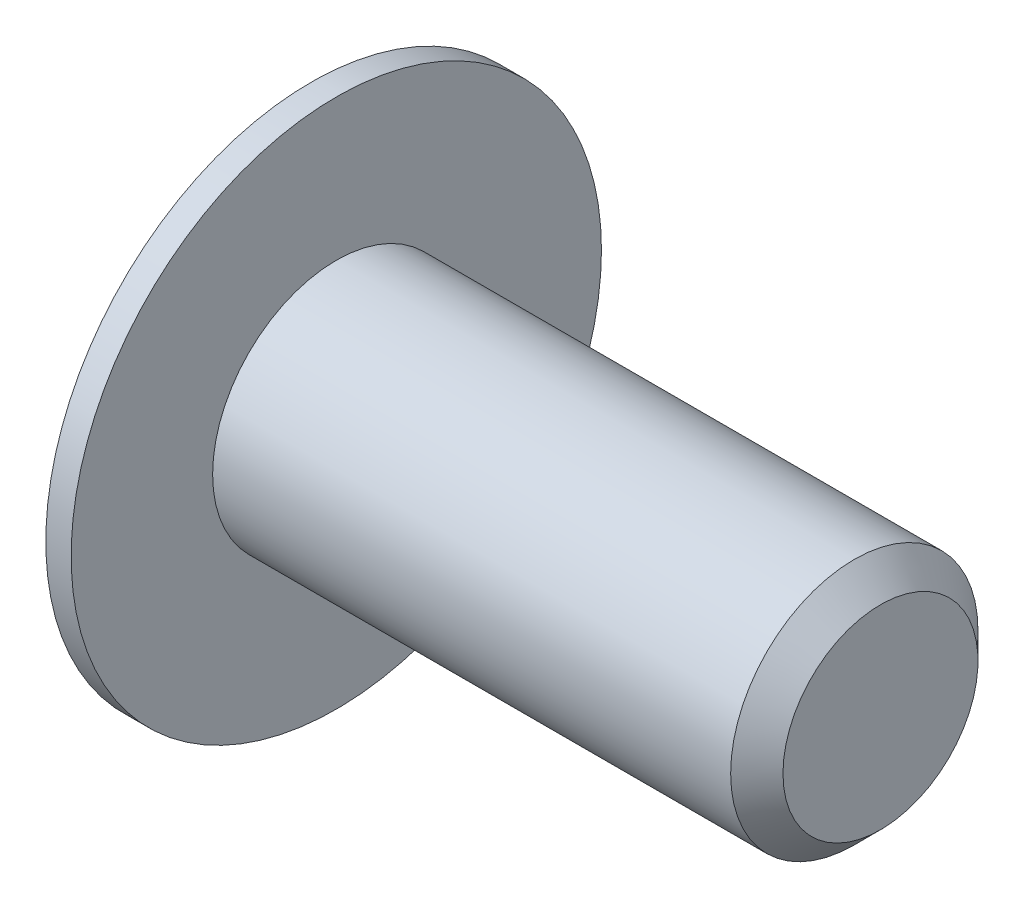
ISO-10303-21;
HEADER;
FILE_DESCRIPTION(('STEP AP214'),'2;1');
FILE_NAME('part.step','',(''),(''),'','','');
FILE_SCHEMA(('AUTOMOTIVE_DESIGN { 1 0 10303 214 1 1 1 1 }'));
ENDSEC;
DATA;
#1=APPLICATION_CONTEXT('core data for automotive mechanical design processes');
#2=APPLICATION_PROTOCOL_DEFINITION('international standard','automotive_design',2000,#1);
#3=PRODUCT_CONTEXT('',#1,'mechanical');
#4=PRODUCT('Part','Part','',(#3));
#5=PRODUCT_RELATED_PRODUCT_CATEGORY('part','',(#4));
#6=PRODUCT_DEFINITION_FORMATION('','',#4);
#7=PRODUCT_DEFINITION_CONTEXT('part definition',#1,'design');
#8=PRODUCT_DEFINITION('design','',#6,#7);
#9=PRODUCT_DEFINITION_SHAPE('','',#8);
#10=(LENGTH_UNIT() NAMED_UNIT(*) SI_UNIT(.MILLI.,.METRE.));
#11=(NAMED_UNIT(*) PLANE_ANGLE_UNIT() SI_UNIT($,.RADIAN.));
#12=(NAMED_UNIT(*) SI_UNIT($,.STERADIAN.) SOLID_ANGLE_UNIT());
#13=UNCERTAINTY_MEASURE_WITH_UNIT(LENGTH_MEASURE(1.E-05),#10,'distance_accuracy_value','');
#14=(GEOMETRIC_REPRESENTATION_CONTEXT(3) GLOBAL_UNCERTAINTY_ASSIGNED_CONTEXT((#13)) GLOBAL_UNIT_ASSIGNED_CONTEXT((#10,
#11,#12)) REPRESENTATION_CONTEXT('',''));
#15=CARTESIAN_POINT('',(0.,0.,0.));
#16=DIRECTION('',(0.,0.,1.));
#17=DIRECTION('',(1.,0.,0.));
#18=AXIS2_PLACEMENT_3D('',#15,#16,#17);
#19=CARTESIAN_POINT('',(4.17346030876218,0.,0.));
#20=DIRECTION('',(1.,0.,0.));
#21=DIRECTION('',(0.,0.,-1.));
#22=AXIS2_PLACEMENT_3D('',#19,#20,#21);
#23=DEGENERATE_TOROIDAL_SURFACE('',#22,0.763153362551684,8.50899999999983,.T.);
#24=CARTESIAN_POINT('',(-4.064,0.,0.));
#25=DIRECTION('',(1.,0.,0.));
#26=DIRECTION('',(0.,0.,-1.));
#27=AXIS2_PLACEMENT_3D('',#24,#25,#26);
#28=CIRCLE('',#27,2.8956);
#29=CARTESIAN_POINT('',(-4.064,0.,-2.8956));
#30=VERTEX_POINT('',#29);
#31=EDGE_CURVE('E147',#30,#30,#28,.T.);
#32=ORIENTED_EDGE('',*,*,#31,.T.);
#33=EDGE_LOOP('',(#32));
#34=FACE_BOUND('',#33,.T.);
#35=CARTESIAN_POINT('',(-0.8128,0.,0.));
#36=DIRECTION('',(1.,0.,0.));
#37=DIRECTION('',(0.,0.,-1.));
#38=AXIS2_PLACEMENT_3D('',#35,#36,#37);
#39=CIRCLE('',#38,7.6581);
#40=CARTESIAN_POINT('',(-0.8128,0.,-7.6581));
#41=VERTEX_POINT('',#40);
#42=EDGE_CURVE('E138',#41,#41,#39,.T.);
#43=ORIENTED_EDGE('',*,*,#42,.F.);
#44=EDGE_LOOP('',(#43));
#45=FACE_BOUND('',#44,.T.);
#46=ADVANCED_FACE('F35',(#34,#45),#23,.T.);
#47=CARTESIAN_POINT('',(-4.064,2.8956,0.));
#48=DIRECTION('',(-1.,0.,0.));
#49=DIRECTION('',(0.,0.,1.));
#50=AXIS2_PLACEMENT_3D('',#47,#48,#49);
#51=PLANE('',#50);
#52=DIRECTION('',(0.,-0.499999999999982,0.866025403784449));
#53=VECTOR('',#52,1.);
#54=CARTESIAN_POINT('',(-4.064,-1.3931461995546,-2.413));
#55=LINE('',#54,#53);
#56=CARTESIAN_POINT('',(-4.064,-1.3931461995546,-2.413));
#57=VERTEX_POINT('',#56);
#58=CARTESIAN_POINT('',(-4.064,-2.7862923991091,0.));
#59=VERTEX_POINT('',#58);
#60=EDGE_CURVE('E51',#57,#59,#55,.T.);
#61=ORIENTED_EDGE('',*,*,#60,.F.);
#62=DIRECTION('',(0.,-1.,0.));
#63=VECTOR('',#62,1.);
#64=CARTESIAN_POINT('',(-4.064,1.3931461995546,-2.413));
#65=LINE('',#64,#63);
#66=CARTESIAN_POINT('',(-4.064,1.3931461995546,-2.413));
#67=VERTEX_POINT('',#66);
#68=EDGE_CURVE('E134',#67,#57,#65,.T.);
#69=ORIENTED_EDGE('',*,*,#68,.F.);
#70=DIRECTION('',(0.,-0.499999999999982,-0.866025403784449));
#71=VECTOR('',#70,1.);
#72=CARTESIAN_POINT('',(-4.064,2.7862923991091,0.));
#73=LINE('',#72,#71);
#74=CARTESIAN_POINT('',(-4.064,2.7862923991091,0.));
#75=VERTEX_POINT('',#74);
#76=EDGE_CURVE('E132',#75,#67,#73,.T.);
#77=ORIENTED_EDGE('',*,*,#76,.F.);
#78=DIRECTION('',(0.,0.499999999999982,-0.866025403784449));
#79=VECTOR('',#78,1.);
#80=CARTESIAN_POINT('',(-4.064,1.3931461995546,2.413));
#81=LINE('',#80,#79);
#82=CARTESIAN_POINT('',(-4.064,1.3931461995546,2.413));
#83=VERTEX_POINT('',#82);
#84=EDGE_CURVE('E99',#83,#75,#81,.T.);
#85=ORIENTED_EDGE('',*,*,#84,.F.);
#86=DIRECTION('',(0.,1.,0.));
#87=VECTOR('',#86,1.);
#88=CARTESIAN_POINT('',(-4.064,-1.3931461995546,2.413));
#89=LINE('',#88,#87);
#90=CARTESIAN_POINT('',(-4.064,-1.3931461995546,2.413));
#91=VERTEX_POINT('',#90);
#92=EDGE_CURVE('E128',#91,#83,#89,.T.);
#93=ORIENTED_EDGE('',*,*,#92,.F.);
#94=DIRECTION('',(0.,0.499999999999982,0.866025403784449));
#95=VECTOR('',#94,1.);
#96=CARTESIAN_POINT('',(-4.064,-2.7862923991091,0.));
#97=LINE('',#96,#95);
#98=EDGE_CURVE('E125',#59,#91,#97,.T.);
#99=ORIENTED_EDGE('',*,*,#98,.F.);
#100=EDGE_LOOP('',(#61,#69,#77,#85,#93,#99));
#101=FACE_BOUND('',#100,.T.);
#102=ORIENTED_EDGE('',*,*,#31,.F.);
#103=EDGE_LOOP('',(#102));
#104=FACE_BOUND('',#103,.T.);
#105=ADVANCED_FACE('F171',(#101,#104),#51,.T.);
#106=CARTESIAN_POINT('',(0.,0.,0.));
#107=DIRECTION('',(1.,0.,0.));
#108=DIRECTION('',(0.,0.,-1.));
#109=AXIS2_PLACEMENT_3D('',#106,#107,#108);
#110=PLANE('',#109);
#111=CARTESIAN_POINT('',(0.,0.,0.));
#112=DIRECTION('',(1.,0.,0.));
#113=DIRECTION('',(0.,0.,-1.));
#114=AXIS2_PLACEMENT_3D('',#111,#112,#113);
#115=CIRCLE('',#114,3.96875);
#116=CARTESIAN_POINT('',(0.,0.,-3.96875));
#117=VERTEX_POINT('',#116);
#118=EDGE_CURVE('E144',#117,#117,#115,.T.);
#119=ORIENTED_EDGE('',*,*,#118,.F.);
#120=EDGE_LOOP('',(#119));
#121=FACE_BOUND('',#120,.T.);
#122=CARTESIAN_POINT('',(0.,0.,0.));
#123=DIRECTION('',(1.,0.,0.));
#124=DIRECTION('',(0.,0.,-1.));
#125=AXIS2_PLACEMENT_3D('',#122,#123,#124);
#126=CIRCLE('',#125,8.509);
#127=CARTESIAN_POINT('',(0.,0.,-8.509));
#128=VERTEX_POINT('',#127);
#129=EDGE_CURVE('E153',#128,#128,#126,.T.);
#130=ORIENTED_EDGE('',*,*,#129,.T.);
#131=EDGE_LOOP('',(#130));
#132=FACE_BOUND('',#131,.T.);
#133=ADVANCED_FACE('F176',(#121,#132),#110,.T.);
#134=CARTESIAN_POINT('',(-4.064,0.,0.));
#135=DIRECTION('',(1.,0.,0.));
#136=DIRECTION('',(0.,0.,-1.));
#137=AXIS2_PLACEMENT_3D('',#134,#135,#136);
#138=CYLINDRICAL_SURFACE('',#137,8.509);
#139=CARTESIAN_POINT('',(-0.8128,0.,0.));
#140=DIRECTION('',(1.,0.,0.));
#141=DIRECTION('',(0.,0.,-1.));
#142=AXIS2_PLACEMENT_3D('',#139,#140,#141);
#143=CIRCLE('',#142,8.509);
#144=CARTESIAN_POINT('',(-0.8128,0.,-8.509));
#145=VERTEX_POINT('',#144);
#146=EDGE_CURVE('E150',#145,#145,#143,.T.);
#147=ORIENTED_EDGE('',*,*,#146,.T.);
#148=EDGE_LOOP('',(#147));
#149=FACE_BOUND('',#148,.T.);
#150=ORIENTED_EDGE('',*,*,#129,.F.);
#151=EDGE_LOOP('',(#150));
#152=FACE_BOUND('',#151,.T.);
#153=ADVANCED_FACE('F183',(#149,#152),#138,.T.);
#154=CARTESIAN_POINT('',(-0.8128,8.509,0.));
#155=DIRECTION('',(-1.,0.,0.));
#156=DIRECTION('',(0.,0.,1.));
#157=AXIS2_PLACEMENT_3D('',#154,#155,#156);
#158=PLANE('',#157);
#159=ORIENTED_EDGE('',*,*,#42,.T.);
#160=EDGE_LOOP('',(#159));
#161=FACE_BOUND('',#160,.T.);
#162=ORIENTED_EDGE('',*,*,#146,.F.);
#163=EDGE_LOOP('',(#162));
#164=FACE_BOUND('',#163,.T.);
#165=ADVANCED_FACE('F187',(#161,#164),#158,.T.);
#166=CARTESIAN_POINT('',(17.4625,0.,0.));
#167=DIRECTION('',(-1.,0.,0.));
#168=DIRECTION('',(0.,0.,1.));
#169=AXIS2_PLACEMENT_3D('',#166,#167,#168);
#170=CYLINDRICAL_SURFACE('',#169,3.96875);
#171=CARTESIAN_POINT('',(16.62303,0.,0.));
#172=DIRECTION('',(1.,0.,0.));
#173=DIRECTION('',(0.,0.,-1.));
#174=AXIS2_PLACEMENT_3D('',#171,#172,#173);
#175=CIRCLE('',#174,3.96875);
#176=CARTESIAN_POINT('',(16.62303,0.,3.96875));
#177=VERTEX_POINT('',#176);
#178=EDGE_CURVE('E11',#177,#177,#175,.F.);
#179=ORIENTED_EDGE('',*,*,#178,.T.);
#180=EDGE_LOOP('',(#179));
#181=FACE_BOUND('',#180,.T.);
#182=ORIENTED_EDGE('',*,*,#118,.T.);
#183=EDGE_LOOP('',(#182));
#184=FACE_BOUND('',#183,.T.);
#185=ADVANCED_FACE('F191',(#181,#184),#170,.T.);
#186=CARTESIAN_POINT('',(17.4625,0.,0.));
#187=DIRECTION('',(1.,0.,0.));
#188=DIRECTION('',(0.,0.,-1.));
#189=AXIS2_PLACEMENT_3D('',#186,#187,#188);
#190=PLANE('',#189);
#191=CARTESIAN_POINT('',(17.4625,0.,0.));
#192=DIRECTION('',(1.,0.,0.));
#193=DIRECTION('',(0.,0.,-1.));
#194=AXIS2_PLACEMENT_3D('',#191,#192,#193);
#195=CIRCLE('',#194,3.12928);
#196=CARTESIAN_POINT('',(17.4625,0.,3.12928000000001));
#197=VERTEX_POINT('',#196);
#198=EDGE_CURVE('E44',#197,#197,#195,.T.);
#199=ORIENTED_EDGE('',*,*,#198,.T.);
#200=EDGE_LOOP('',(#199));
#201=FACE_BOUND('',#200,.T.);
#202=ADVANCED_FACE('F160',(#201),#190,.T.);
#203=CARTESIAN_POINT('',(-0.508,-1.3931461995546,-2.413));
#204=DIRECTION('',(0.,-0.866025403784449,-0.499999999999982));
#205=DIRECTION('',(0.,0.499999999999982,-0.866025403784449));
#206=AXIS2_PLACEMENT_3D('',#203,#204,#205);
#207=PLANE('',#206);
#208=ORIENTED_EDGE('',*,*,#60,.T.);
#209=DIRECTION('',(-1.,0.,0.));
#210=VECTOR('',#209,1.);
#211=CARTESIAN_POINT('',(-0.508,-2.7862923991091,0.));
#212=LINE('',#211,#210);
#213=CARTESIAN_POINT('',(-0.508,-2.7862923991091,0.));
#214=VERTEX_POINT('',#213);
#215=EDGE_CURVE('E81',#214,#59,#212,.T.);
#216=ORIENTED_EDGE('',*,*,#215,.F.);
#217=DIRECTION('',(0.,-0.499999999999982,0.866025403784449));
#218=VECTOR('',#217,1.);
#219=CARTESIAN_POINT('',(-0.508,-1.3931461995546,-2.413));
#220=LINE('',#219,#218);
#221=CARTESIAN_POINT('',(-0.508,-1.3931461995546,-2.413));
#222=VERTEX_POINT('',#221);
#223=EDGE_CURVE('E136',#222,#214,#220,.T.);
#224=ORIENTED_EDGE('',*,*,#223,.F.);
#225=DIRECTION('',(-1.,0.,0.));
#226=VECTOR('',#225,1.);
#227=CARTESIAN_POINT('',(-0.508,-1.3931461995546,-2.413));
#228=LINE('',#227,#226);
#229=EDGE_CURVE('E59',#222,#57,#228,.T.);
#230=ORIENTED_EDGE('',*,*,#229,.T.);
#231=EDGE_LOOP('',(#208,#216,#224,#230));
#232=FACE_BOUND('',#231,.T.);
#233=ADVANCED_FACE('F198',(#232),#207,.F.);
#234=CARTESIAN_POINT('',(-0.508,1.3931461995546,-2.413));
#235=DIRECTION('',(0.,0.,-1.));
#236=DIRECTION('',(-1.,0.,0.));
#237=AXIS2_PLACEMENT_3D('',#234,#235,#236);
#238=PLANE('',#237);
#239=ORIENTED_EDGE('',*,*,#68,.T.);
#240=ORIENTED_EDGE('',*,*,#229,.F.);
#241=DIRECTION('',(0.,-1.,0.));
#242=VECTOR('',#241,1.);
#243=CARTESIAN_POINT('',(-0.508,1.3931461995546,-2.413));
#244=LINE('',#243,#242);
#245=CARTESIAN_POINT('',(-0.508,1.3931461995546,-2.413));
#246=VERTEX_POINT('',#245);
#247=EDGE_CURVE('E111',#246,#222,#244,.T.);
#248=ORIENTED_EDGE('',*,*,#247,.F.);
#249=DIRECTION('',(-1.,0.,0.));
#250=VECTOR('',#249,1.);
#251=CARTESIAN_POINT('',(-0.508,1.3931461995546,-2.413));
#252=LINE('',#251,#250);
#253=EDGE_CURVE('E103',#246,#67,#252,.T.);
#254=ORIENTED_EDGE('',*,*,#253,.T.);
#255=EDGE_LOOP('',(#239,#240,#248,#254));
#256=FACE_BOUND('',#255,.T.);
#257=ADVANCED_FACE('F201',(#256),#238,.F.);
#258=CARTESIAN_POINT('',(-0.508,2.7862923991091,0.));
#259=DIRECTION('',(0.,0.866025403784449,-0.499999999999982));
#260=DIRECTION('',(0.,0.499999999999982,0.866025403784449));
#261=AXIS2_PLACEMENT_3D('',#258,#259,#260);
#262=PLANE('',#261);
#263=ORIENTED_EDGE('',*,*,#76,.T.);
#264=ORIENTED_EDGE('',*,*,#253,.F.);
#265=DIRECTION('',(0.,-0.499999999999982,-0.866025403784449));
#266=VECTOR('',#265,1.);
#267=CARTESIAN_POINT('',(-0.508,2.7862923991091,0.));
#268=LINE('',#267,#266);
#269=CARTESIAN_POINT('',(-0.508,2.7862923991091,0.));
#270=VERTEX_POINT('',#269);
#271=EDGE_CURVE('E107',#270,#246,#268,.T.);
#272=ORIENTED_EDGE('',*,*,#271,.F.);
#273=DIRECTION('',(-1.,0.,0.));
#274=VECTOR('',#273,1.);
#275=CARTESIAN_POINT('',(-0.508,2.7862923991091,0.));
#276=LINE('',#275,#274);
#277=EDGE_CURVE('E92',#270,#75,#276,.T.);
#278=ORIENTED_EDGE('',*,*,#277,.T.);
#279=EDGE_LOOP('',(#263,#264,#272,#278));
#280=FACE_BOUND('',#279,.T.);
#281=ADVANCED_FACE('F108',(#280),#262,.F.);
#282=CARTESIAN_POINT('',(-0.508,1.3931461995546,2.413));
#283=DIRECTION('',(0.,0.866025403784449,0.499999999999982));
#284=DIRECTION('',(0.,-0.499999999999982,0.866025403784449));
#285=AXIS2_PLACEMENT_3D('',#282,#283,#284);
#286=PLANE('',#285);
#287=ORIENTED_EDGE('',*,*,#84,.T.);
#288=ORIENTED_EDGE('',*,*,#277,.F.);
#289=DIRECTION('',(0.,0.499999999999982,-0.866025403784449));
#290=VECTOR('',#289,1.);
#291=CARTESIAN_POINT('',(-0.508,1.3931461995546,2.413));
#292=LINE('',#291,#290);
#293=CARTESIAN_POINT('',(-0.508,1.3931461995546,2.413));
#294=VERTEX_POINT('',#293);
#295=EDGE_CURVE('E96',#294,#270,#292,.T.);
#296=ORIENTED_EDGE('',*,*,#295,.F.);
#297=DIRECTION('',(-1.,0.,0.));
#298=VECTOR('',#297,1.);
#299=CARTESIAN_POINT('',(-0.508,1.3931461995546,2.413));
#300=LINE('',#299,#298);
#301=EDGE_CURVE('E104',#294,#83,#300,.T.);
#302=ORIENTED_EDGE('',*,*,#301,.T.);
#303=EDGE_LOOP('',(#287,#288,#296,#302));
#304=FACE_BOUND('',#303,.T.);
#305=ADVANCED_FACE('F94',(#304),#286,.F.);
#306=CARTESIAN_POINT('',(-0.508,-1.3931461995546,2.413));
#307=DIRECTION('',(0.,0.,1.));
#308=DIRECTION('',(1.,0.,0.));
#309=AXIS2_PLACEMENT_3D('',#306,#307,#308);
#310=PLANE('',#309);
#311=ORIENTED_EDGE('',*,*,#92,.T.);
#312=ORIENTED_EDGE('',*,*,#301,.F.);
#313=DIRECTION('',(0.,1.,0.));
#314=VECTOR('',#313,1.);
#315=CARTESIAN_POINT('',(-0.508,-1.3931461995546,2.413));
#316=LINE('',#315,#314);
#317=CARTESIAN_POINT('',(-0.508,-1.3931461995546,2.413));
#318=VERTEX_POINT('',#317);
#319=EDGE_CURVE('E117',#318,#294,#316,.T.);
#320=ORIENTED_EDGE('',*,*,#319,.F.);
#321=DIRECTION('',(-1.,0.,0.));
#322=VECTOR('',#321,1.);
#323=CARTESIAN_POINT('',(-0.508,-1.3931461995546,2.413));
#324=LINE('',#323,#322);
#325=EDGE_CURVE('E141',#318,#91,#324,.T.);
#326=ORIENTED_EDGE('',*,*,#325,.T.);
#327=EDGE_LOOP('',(#311,#312,#320,#326));
#328=FACE_BOUND('',#327,.T.);
#329=ADVANCED_FACE('F204',(#328),#310,.F.);
#330=CARTESIAN_POINT('',(-0.508,-2.7862923991091,0.));
#331=DIRECTION('',(0.,-0.866025403784449,0.499999999999982));
#332=DIRECTION('',(0.,-0.499999999999982,-0.866025403784449));
#333=AXIS2_PLACEMENT_3D('',#330,#331,#332);
#334=PLANE('',#333);
#335=ORIENTED_EDGE('',*,*,#98,.T.);
#336=ORIENTED_EDGE('',*,*,#325,.F.);
#337=DIRECTION('',(0.,0.499999999999982,0.866025403784449));
#338=VECTOR('',#337,1.);
#339=CARTESIAN_POINT('',(-0.508,-2.7862923991091,0.));
#340=LINE('',#339,#338);
#341=EDGE_CURVE('E119',#214,#318,#340,.T.);
#342=ORIENTED_EDGE('',*,*,#341,.F.);
#343=ORIENTED_EDGE('',*,*,#215,.T.);
#344=EDGE_LOOP('',(#335,#336,#342,#343));
#345=FACE_BOUND('',#344,.T.);
#346=ADVANCED_FACE('F167',(#345),#334,.F.);
#347=CARTESIAN_POINT('',(-0.508,0.,0.));
#348=DIRECTION('',(-1.,0.,0.));
#349=DIRECTION('',(0.,0.,1.));
#350=AXIS2_PLACEMENT_3D('',#347,#348,#349);
#351=PLANE('',#350);
#352=ORIENTED_EDGE('',*,*,#223,.T.);
#353=ORIENTED_EDGE('',*,*,#341,.T.);
#354=ORIENTED_EDGE('',*,*,#319,.T.);
#355=ORIENTED_EDGE('',*,*,#295,.T.);
#356=ORIENTED_EDGE('',*,*,#271,.T.);
#357=ORIENTED_EDGE('',*,*,#247,.T.);
#358=EDGE_LOOP('',(#352,#353,#354,#355,#356,#357));
#359=FACE_BOUND('',#358,.T.);
#360=ADVANCED_FACE('F114',(#359),#351,.T.);
#361=CARTESIAN_POINT('',(17.4625,0.,0.));
#362=DIRECTION('',(-1.,0.,0.));
#363=DIRECTION('',(0.,0.,1.));
#364=AXIS2_PLACEMENT_3D('',#361,#362,#363);
#365=CONICAL_SURFACE('',#364,3.12928,0.785398163397444);
#366=CARTESIAN_POINT('',(16.62303,0.,3.96875));
#367=CARTESIAN_POINT('',(16.6317744791667,0.,3.96000552083334));
#368=CARTESIAN_POINT('',(16.6405189583333,0.,3.95126104166667));
#369=CARTESIAN_POINT('',(16.6580079166667,0.,3.93377208333334));
#370=CARTESIAN_POINT('',(16.6667523958333,0.,3.92502760416667));
#371=CARTESIAN_POINT('',(16.6842413541667,0.,3.90753864583333));
#372=CARTESIAN_POINT('',(16.6929858333333,0.,3.89879416666667));
#373=CARTESIAN_POINT('',(16.7104747916667,0.,3.88130520833334));
#374=CARTESIAN_POINT('',(16.7192192708333,0.,3.87256072916667));
#375=CARTESIAN_POINT('',(16.7367082291667,0.,3.85507177083334));
#376=CARTESIAN_POINT('',(16.7454527083333,0.,3.84632729166667));
#377=CARTESIAN_POINT('',(16.7629416666667,0.,3.82883833333334));
#378=CARTESIAN_POINT('',(16.7716861458333,0.,3.82009385416667));
#379=CARTESIAN_POINT('',(16.7891751041667,0.,3.80260489583334));
#380=CARTESIAN_POINT('',(16.7979195833333,0.,3.79386041666667));
#381=CARTESIAN_POINT('',(16.8154085416667,0.,3.77637145833334));
#382=CARTESIAN_POINT('',(16.8241530208333,0.,3.76762697916667));
#383=CARTESIAN_POINT('',(16.8416419791667,0.,3.75013802083334));
#384=CARTESIAN_POINT('',(16.8503864583333,0.,3.74139354166667));
#385=CARTESIAN_POINT('',(16.8678754166667,0.,3.72390458333334));
#386=CARTESIAN_POINT('',(16.8766198958333,0.,3.71516010416667));
#387=CARTESIAN_POINT('',(16.8941088541667,0.,3.69767114583334));
#388=CARTESIAN_POINT('',(16.9028533333333,0.,3.68892666666667));
#389=CARTESIAN_POINT('',(16.9203422916667,0.,3.67143770833334));
#390=CARTESIAN_POINT('',(16.9290867708333,0.,3.66269322916667));
#391=CARTESIAN_POINT('',(16.9465757291667,0.,3.64520427083334));
#392=CARTESIAN_POINT('',(16.9553202083333,0.,3.63645979166667));
#393=CARTESIAN_POINT('',(16.9728091666667,0.,3.61897083333334));
#394=CARTESIAN_POINT('',(16.9815536458333,0.,3.61022635416667));
#395=CARTESIAN_POINT('',(16.9990426041667,0.,3.59273739583334));
#396=CARTESIAN_POINT('',(17.0077870833333,0.,3.58399291666667));
#397=CARTESIAN_POINT('',(17.0252760416667,0.,3.56650395833334));
#398=CARTESIAN_POINT('',(17.0340205208333,0.,3.55775947916667));
#399=CARTESIAN_POINT('',(17.0515094791667,0.,3.54027052083334));
#400=CARTESIAN_POINT('',(17.0602539583333,0.,3.53152604166667));
#401=CARTESIAN_POINT('',(17.0777429166667,0.,3.51403708333334));
#402=CARTESIAN_POINT('',(17.0864873958333,0.,3.50529260416667));
#403=CARTESIAN_POINT('',(17.1039763541667,0.,3.48780364583334));
#404=CARTESIAN_POINT('',(17.1127208333333,0.,3.47905916666667));
#405=CARTESIAN_POINT('',(17.1302097916667,0.,3.46157020833334));
#406=CARTESIAN_POINT('',(17.1389542708333,0.,3.45282572916667));
#407=CARTESIAN_POINT('',(17.1564432291667,0.,3.43533677083334));
#408=CARTESIAN_POINT('',(17.1651877083333,0.,3.42659229166667));
#409=CARTESIAN_POINT('',(17.1826766666667,0.,3.40910333333334));
#410=CARTESIAN_POINT('',(17.1914211458333,0.,3.40035885416667));
#411=CARTESIAN_POINT('',(17.2089101041667,0.,3.38286989583334));
#412=CARTESIAN_POINT('',(17.2176545833333,0.,3.37412541666667));
#413=CARTESIAN_POINT('',(17.2351435416667,0.,3.35663645833334));
#414=CARTESIAN_POINT('',(17.2438880208333,0.,3.34789197916667));
#415=CARTESIAN_POINT('',(17.2613769791667,0.,3.33040302083334));
#416=CARTESIAN_POINT('',(17.2701214583333,0.,3.32165854166667));
#417=CARTESIAN_POINT('',(17.2876104166667,0.,3.30416958333334));
#418=CARTESIAN_POINT('',(17.2963548958333,0.,3.29542510416667));
#419=CARTESIAN_POINT('',(17.3138438541667,0.,3.27793614583334));
#420=CARTESIAN_POINT('',(17.3225883333333,0.,3.26919166666667));
#421=CARTESIAN_POINT('',(17.3400772916667,0.,3.25170270833334));
#422=CARTESIAN_POINT('',(17.3488217708333,0.,3.24295822916667));
#423=CARTESIAN_POINT('',(17.3663107291667,0.,3.22546927083334));
#424=CARTESIAN_POINT('',(17.3750552083333,0.,3.21672479166667));
#425=CARTESIAN_POINT('',(17.3925441666667,0.,3.19923583333334));
#426=CARTESIAN_POINT('',(17.4012886458333,0.,3.19049135416667));
#427=CARTESIAN_POINT('',(17.4187776041667,0.,3.17300239583334));
#428=CARTESIAN_POINT('',(17.4275220833333,0.,3.16425791666667));
#429=CARTESIAN_POINT('',(17.4450110416667,0.,3.14676895833334));
#430=CARTESIAN_POINT('',(17.4537555208333,0.,3.13802447916667));
#431=CARTESIAN_POINT('',(17.4625,0.,3.12928000000001));
#432=B_SPLINE_CURVE_WITH_KNOTS('',3,(#366,#367,#368,#369,#370,#371,#372,#373,#374,#375,#376,
#377,#378,#379,#380,#381,#382,#383,#384,#385,#386,#387,#388,#389,#390,#391,#392,#393,#394,#395,
#396,#397,#398,#399,#400,#401,#402,#403,#404,#405,#406,#407,#408,#409,#410,#411,#412,#413,#414,
#415,#416,#417,#418,#419,#420,#421,#422,#423,#424,#425,#426,#427,#428,#429,#430,#431),
.UNSPECIFIED.,.F.,.F.,(4,2,2,2,2,2,2,2,2,2,2,2,2,2,2,2,2,2,2,2,2,2,2,2,2,2,2,2,2,2,2,2,4),(0.,
0.0370996831001679,0.0741993662003341,0.111299049300502,0.148398732400668,0.185498415500836,
0.222598098601002,0.25969778170117,0.296797464801336,0.333897147901502,0.37099683100167,
0.408096514101836,0.445196197202004,0.48229588030217,0.519395563402338,0.556495246502504,
0.59359492960267,0.630694612702838,0.667794295803004,0.704893978903172,0.741993662003338,
0.779093345103507,0.816193028203672,0.853292711303841,0.890392394404006,0.927492077504172,
0.964591760604341,1.00169144370451,1.03879112680467,1.07589080990484,1.11299049300501,
1.15009017610517,1.18718985920534),.UNSPECIFIED.);
#433=EDGE_CURVE('BSEAM38',#177,#197,#432,.T.);
#434=ORIENTED_EDGE('',*,*,#178,.F.);
#435=ORIENTED_EDGE('',*,*,#198,.F.);
#436=ORIENTED_EDGE('',*,*,#433,.T.);
#437=ORIENTED_EDGE('',*,*,#433,.F.);
#438=EDGE_LOOP('',(#434,#436,#435,#437));
#439=FACE_BOUND('',#438,.T.);
#440=ADVANCED_FACE('F38',(#439),#365,.T.);
#441=CLOSED_SHELL('',(#46,#105,#133,#153,#165,#185,#202,#233,#257,#281,#305,#329,#346,#360,#440));
#442=MANIFOLD_SOLID_BREP('B2',#441);
#443=ADVANCED_BREP_SHAPE_REPRESENTATION('',(#18,#442),#14);
#444=SHAPE_DEFINITION_REPRESENTATION(#9,#443);
ENDSEC;
END-ISO-10303-21;
